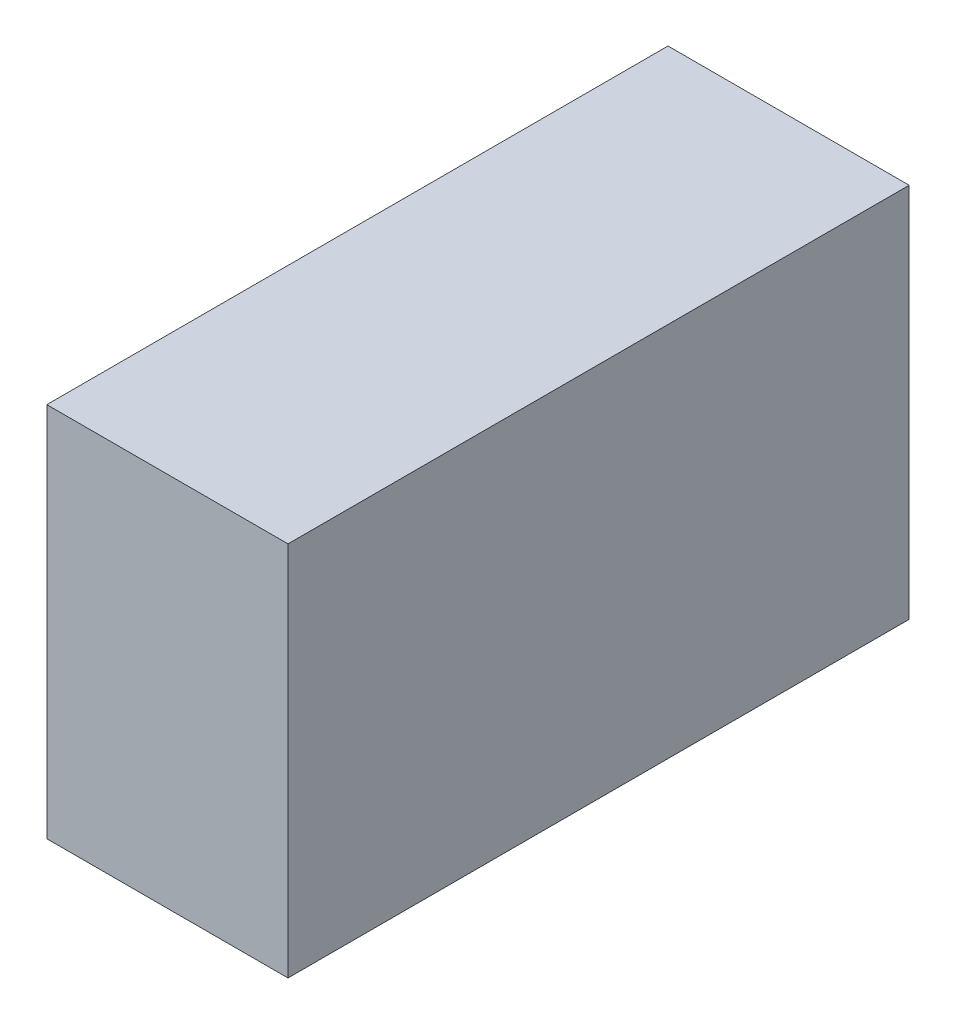
ISO-10303-21;
HEADER;
FILE_DESCRIPTION(('STEP AP214'),'2;1');
FILE_NAME('part.step','',(''),(''),'','','');
FILE_SCHEMA(('AUTOMOTIVE_DESIGN { 1 0 10303 214 1 1 1 1 }'));
ENDSEC;
DATA;
#1=APPLICATION_CONTEXT('core data for automotive mechanical design processes');
#2=APPLICATION_PROTOCOL_DEFINITION('international standard','automotive_design',2000,#1);
#3=PRODUCT_CONTEXT('',#1,'mechanical');
#4=PRODUCT('Part','Part','',(#3));
#5=PRODUCT_RELATED_PRODUCT_CATEGORY('part','',(#4));
#6=PRODUCT_DEFINITION_FORMATION('','',#4);
#7=PRODUCT_DEFINITION_CONTEXT('part definition',#1,'design');
#8=PRODUCT_DEFINITION('design','',#6,#7);
#9=PRODUCT_DEFINITION_SHAPE('','',#8);
#10=(LENGTH_UNIT() NAMED_UNIT(*) SI_UNIT(.MILLI.,.METRE.));
#11=(NAMED_UNIT(*) PLANE_ANGLE_UNIT() SI_UNIT($,.RADIAN.));
#12=(NAMED_UNIT(*) SI_UNIT($,.STERADIAN.) SOLID_ANGLE_UNIT());
#13=UNCERTAINTY_MEASURE_WITH_UNIT(LENGTH_MEASURE(1.E-05),#10,'distance_accuracy_value','');
#14=(GEOMETRIC_REPRESENTATION_CONTEXT(3) GLOBAL_UNCERTAINTY_ASSIGNED_CONTEXT((#13)) GLOBAL_UNIT_ASSIGNED_CONTEXT((#10,
#11,#12)) REPRESENTATION_CONTEXT('',''));
#15=CARTESIAN_POINT('',(0.,0.,0.));
#16=DIRECTION('',(0.,0.,1.));
#17=DIRECTION('',(1.,0.,0.));
#18=AXIS2_PLACEMENT_3D('',#15,#16,#17);
#19=CARTESIAN_POINT('',(-14.0179776332802,-29.2899162324159,26.795115960338));
#20=DIRECTION('',(-1.,0.,0.));
#21=DIRECTION('',(0.,0.,1.));
#22=AXIS2_PLACEMENT_3D('',#19,#20,#21);
#23=PLANE('',#22);
#24=DIRECTION('',(0.,1.,0.));
#25=VECTOR('',#24,1.);
#26=CARTESIAN_POINT('',(-14.0179776332802,-29.2899162324159,27.3733769144023));
#27=LINE('',#26,#25);
#28=CARTESIAN_POINT('',(-14.0179776332802,-29.2899162324159,27.3733769144023));
#29=VERTEX_POINT('',#28);
#30=CARTESIAN_POINT('',(-14.0179776332802,-28.9399162324159,27.3733769144023));
#31=VERTEX_POINT('',#30);
#32=EDGE_CURVE('E37',#29,#31,#27,.T.);
#33=ORIENTED_EDGE('',*,*,#32,.T.);
#34=DIRECTION('',(0.,0.,1.));
#35=VECTOR('',#34,1.);
#36=CARTESIAN_POINT('',(-14.0179776332802,-28.9399162324159,26.795115960338));
#37=LINE('',#36,#35);
#38=CARTESIAN_POINT('',(-14.0179776332802,-28.9399162324159,26.795115960338));
#39=VERTEX_POINT('',#38);
#40=EDGE_CURVE('E74',#39,#31,#37,.T.);
#41=ORIENTED_EDGE('',*,*,#40,.F.);
#42=DIRECTION('',(0.,1.,0.));
#43=VECTOR('',#42,1.);
#44=CARTESIAN_POINT('',(-14.0179776332802,-29.2899162324159,26.795115960338));
#45=LINE('',#44,#43);
#46=CARTESIAN_POINT('',(-14.0179776332802,-29.2899162324159,26.795115960338));
#47=VERTEX_POINT('',#46);
#48=EDGE_CURVE('E11',#47,#39,#45,.T.);
#49=ORIENTED_EDGE('',*,*,#48,.F.);
#50=DIRECTION('',(0.,0.,1.));
#51=VECTOR('',#50,1.);
#52=CARTESIAN_POINT('',(-14.0179776332802,-29.2899162324159,26.795115960338));
#53=LINE('',#52,#51);
#54=EDGE_CURVE('E75',#47,#29,#53,.T.);
#55=ORIENTED_EDGE('',*,*,#54,.T.);
#56=EDGE_LOOP('',(#33,#41,#49,#55));
#57=FACE_BOUND('',#56,.T.);
#58=ADVANCED_FACE('F34',(#57),#23,.T.);
#59=CARTESIAN_POINT('',(-14.0179776332802,-29.2899162324159,26.795115960338));
#60=DIRECTION('',(0.,0.,-1.));
#61=DIRECTION('',(-1.,0.,0.));
#62=AXIS2_PLACEMENT_3D('',#59,#60,#61);
#63=PLANE('',#62);
#64=ORIENTED_EDGE('',*,*,#48,.T.);
#65=DIRECTION('',(-1.,0.,0.));
#66=VECTOR('',#65,1.);
#67=CARTESIAN_POINT('',(-14.0179776332802,-28.9399162324159,26.795115960338));
#68=LINE('',#67,#66);
#69=CARTESIAN_POINT('',(-13.7934716132696,-28.9399162324159,26.795115960338));
#70=VERTEX_POINT('',#69);
#71=EDGE_CURVE('E91',#70,#39,#68,.T.);
#72=ORIENTED_EDGE('',*,*,#71,.F.);
#73=DIRECTION('',(0.,1.,0.));
#74=VECTOR('',#73,1.);
#75=CARTESIAN_POINT('',(-13.7934716132696,-29.2899162324159,26.795115960338));
#76=LINE('',#75,#74);
#77=CARTESIAN_POINT('',(-13.7934716132696,-29.2899162324159,26.795115960338));
#78=VERTEX_POINT('',#77);
#79=EDGE_CURVE('E42',#78,#70,#76,.T.);
#80=ORIENTED_EDGE('',*,*,#79,.F.);
#81=DIRECTION('',(-1.,0.,0.));
#82=VECTOR('',#81,1.);
#83=CARTESIAN_POINT('',(-14.0179776332802,-29.2899162324159,26.795115960338));
#84=LINE('',#83,#82);
#85=EDGE_CURVE('E80',#78,#47,#84,.T.);
#86=ORIENTED_EDGE('',*,*,#85,.T.);
#87=EDGE_LOOP('',(#64,#72,#80,#86));
#88=FACE_BOUND('',#87,.T.);
#89=ADVANCED_FACE('F106',(#88),#63,.T.);
#90=CARTESIAN_POINT('',(-13.7934716132696,-29.2899162324159,26.795115960338));
#91=DIRECTION('',(1.,0.,0.));
#92=DIRECTION('',(0.,0.,-1.));
#93=AXIS2_PLACEMENT_3D('',#90,#91,#92);
#94=PLANE('',#93);
#95=ORIENTED_EDGE('',*,*,#79,.T.);
#96=DIRECTION('',(0.,0.,-1.));
#97=VECTOR('',#96,1.);
#98=CARTESIAN_POINT('',(-13.7934716132696,-28.9399162324159,26.795115960338));
#99=LINE('',#98,#97);
#100=CARTESIAN_POINT('',(-13.7934716132696,-28.9399162324159,27.3733769144023));
#101=VERTEX_POINT('',#100);
#102=EDGE_CURVE('E87',#101,#70,#99,.T.);
#103=ORIENTED_EDGE('',*,*,#102,.F.);
#104=DIRECTION('',(0.,1.,0.));
#105=VECTOR('',#104,1.);
#106=CARTESIAN_POINT('',(-13.7934716132696,-29.2899162324159,27.3733769144023));
#107=LINE('',#106,#105);
#108=CARTESIAN_POINT('',(-13.7934716132696,-29.2899162324159,27.3733769144023));
#109=VERTEX_POINT('',#108);
#110=EDGE_CURVE('E79',#109,#101,#107,.T.);
#111=ORIENTED_EDGE('',*,*,#110,.F.);
#112=DIRECTION('',(0.,0.,-1.));
#113=VECTOR('',#112,1.);
#114=CARTESIAN_POINT('',(-13.7934716132696,-29.2899162324159,26.795115960338));
#115=LINE('',#114,#113);
#116=EDGE_CURVE('E99',#109,#78,#115,.T.);
#117=ORIENTED_EDGE('',*,*,#116,.T.);
#118=EDGE_LOOP('',(#95,#103,#111,#117));
#119=FACE_BOUND('',#118,.T.);
#120=ADVANCED_FACE('F103',(#119),#94,.T.);
#121=CARTESIAN_POINT('',(-14.0179776332802,-29.2899162324159,27.3733769144023));
#122=DIRECTION('',(0.,0.,1.));
#123=DIRECTION('',(1.,0.,0.));
#124=AXIS2_PLACEMENT_3D('',#121,#122,#123);
#125=PLANE('',#124);
#126=ORIENTED_EDGE('',*,*,#110,.T.);
#127=DIRECTION('',(1.,0.,0.));
#128=VECTOR('',#127,1.);
#129=CARTESIAN_POINT('',(-14.0179776332802,-28.9399162324159,27.3733769144023));
#130=LINE('',#129,#128);
#131=EDGE_CURVE('E82',#31,#101,#130,.T.);
#132=ORIENTED_EDGE('',*,*,#131,.F.);
#133=ORIENTED_EDGE('',*,*,#32,.F.);
#134=DIRECTION('',(1.,0.,0.));
#135=VECTOR('',#134,1.);
#136=CARTESIAN_POINT('',(-14.0179776332802,-29.2899162324159,27.3733769144023));
#137=LINE('',#136,#135);
#138=EDGE_CURVE('E97',#29,#109,#137,.T.);
#139=ORIENTED_EDGE('',*,*,#138,.T.);
#140=EDGE_LOOP('',(#126,#132,#133,#139));
#141=FACE_BOUND('',#140,.T.);
#142=ADVANCED_FACE('F83',(#141),#125,.T.);
#143=CARTESIAN_POINT('',(0.,-29.2899162324159,0.));
#144=DIRECTION('',(0.,1.,0.));
#145=DIRECTION('',(0.,0.,1.));
#146=AXIS2_PLACEMENT_3D('',#143,#144,#145);
#147=PLANE('',#146);
#148=ORIENTED_EDGE('',*,*,#54,.F.);
#149=ORIENTED_EDGE('',*,*,#85,.F.);
#150=ORIENTED_EDGE('',*,*,#116,.F.);
#151=ORIENTED_EDGE('',*,*,#138,.F.);
#152=EDGE_LOOP('',(#148,#149,#150,#151));
#153=FACE_BOUND('',#152,.T.);
#154=ADVANCED_FACE('F108',(#153),#147,.F.);
#155=CARTESIAN_POINT('',(0.,-28.9399162324159,0.));
#156=DIRECTION('',(0.,1.,0.));
#157=DIRECTION('',(0.,0.,1.));
#158=AXIS2_PLACEMENT_3D('',#155,#156,#157);
#159=PLANE('',#158);
#160=ORIENTED_EDGE('',*,*,#40,.T.);
#161=ORIENTED_EDGE('',*,*,#131,.T.);
#162=ORIENTED_EDGE('',*,*,#102,.T.);
#163=ORIENTED_EDGE('',*,*,#71,.T.);
#164=EDGE_LOOP('',(#160,#161,#162,#163));
#165=FACE_BOUND('',#164,.T.);
#166=ADVANCED_FACE('F90',(#165),#159,.T.);
#167=CLOSED_SHELL('',(#58,#89,#120,#142,#154,#166));
#168=MANIFOLD_SOLID_BREP('B2',#167);
#169=ADVANCED_BREP_SHAPE_REPRESENTATION('',(#18,#168),#14);
#170=SHAPE_DEFINITION_REPRESENTATION(#9,#169);
ENDSEC;
END-ISO-10303-21;
